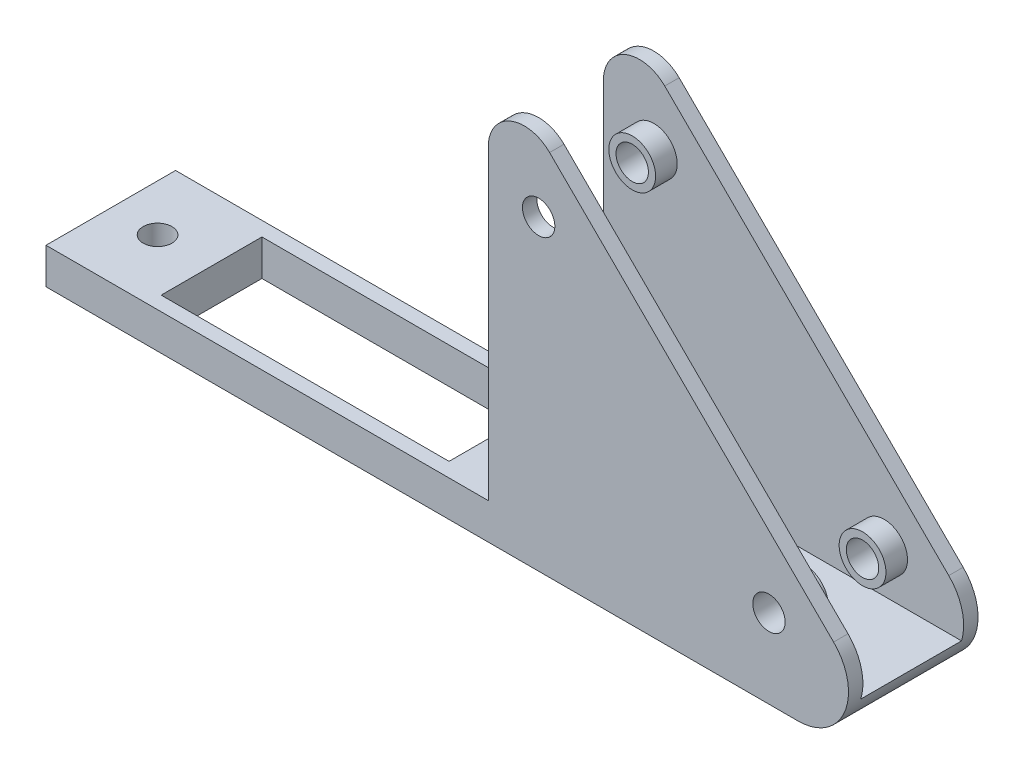
ISO-10303-21;
HEADER;
FILE_DESCRIPTION(('STEP AP214'),'2;1');
FILE_NAME('part.step','',(''),(''),'','','');
FILE_SCHEMA(('AUTOMOTIVE_DESIGN { 1 0 10303 214 1 1 1 1 }'));
ENDSEC;
DATA;
#1=APPLICATION_CONTEXT('core data for automotive mechanical design processes');
#2=APPLICATION_PROTOCOL_DEFINITION('international standard','automotive_design',2000,#1);
#3=PRODUCT_CONTEXT('',#1,'mechanical');
#4=PRODUCT('Part','Part','',(#3));
#5=PRODUCT_RELATED_PRODUCT_CATEGORY('part','',(#4));
#6=PRODUCT_DEFINITION_FORMATION('','',#4);
#7=PRODUCT_DEFINITION_CONTEXT('part definition',#1,'design');
#8=PRODUCT_DEFINITION('design','',#6,#7);
#9=PRODUCT_DEFINITION_SHAPE('','',#8);
#10=(LENGTH_UNIT() NAMED_UNIT(*) SI_UNIT(.MILLI.,.METRE.));
#11=(NAMED_UNIT(*) PLANE_ANGLE_UNIT() SI_UNIT($,.RADIAN.));
#12=(NAMED_UNIT(*) SI_UNIT($,.STERADIAN.) SOLID_ANGLE_UNIT());
#13=UNCERTAINTY_MEASURE_WITH_UNIT(LENGTH_MEASURE(1.E-05),#10,'distance_accuracy_value','');
#14=(GEOMETRIC_REPRESENTATION_CONTEXT(3) GLOBAL_UNCERTAINTY_ASSIGNED_CONTEXT((#13)) GLOBAL_UNIT_ASSIGNED_CONTEXT((#10,
#11,#12)) REPRESENTATION_CONTEXT('',''));
#15=CARTESIAN_POINT('',(0.,0.,0.));
#16=DIRECTION('',(0.,0.,1.));
#17=DIRECTION('',(1.,0.,0.));
#18=AXIS2_PLACEMENT_3D('',#15,#16,#17);
#19=CARTESIAN_POINT('',(0.,0.,-7.));
#20=DIRECTION('',(0.,0.,-1.));
#21=DIRECTION('',(-1.,0.,0.));
#22=AXIS2_PLACEMENT_3D('',#19,#20,#21);
#23=PLANE('',#22);
#24=CARTESIAN_POINT('',(32.447088785675,42.64,-7.));
#25=DIRECTION('',(0.,0.,-1.));
#26=DIRECTION('',(-1.,0.,0.));
#27=AXIS2_PLACEMENT_3D('',#24,#25,#26);
#28=CIRCLE('',#27,3.25);
#29=CARTESIAN_POINT('',(29.197088785675,42.64,-7.));
#30=VERTEX_POINT('',#29);
#31=EDGE_CURVE('E45',#30,#30,#28,.F.);
#32=ORIENTED_EDGE('',*,*,#31,.F.);
#33=EDGE_LOOP('',(#32));
#34=FACE_BOUND('',#33,.T.);
#35=DIRECTION('',(-0.709673079753414,0.704531134779226,0.));
#36=VECTOR('',#35,1.);
#37=CARTESIAN_POINT('',(42.4302873975062,42.7399603023173,-7.));
#38=LINE('',#37,#36);
#39=CARTESIAN_POINT('',(73.4271241007794,11.9677115582739,-7.));
#40=VERTEX_POINT('',#39);
#41=CARTESIAN_POINT('',(33.9683434163894,51.1405931648827,-7.));
#42=VERTEX_POINT('',#41);
#43=EDGE_CURVE('E186',#40,#42,#38,.T.);
#44=ORIENTED_EDGE('',*,*,#43,.T.);
#45=CARTESIAN_POINT('',(30.4456877424932,47.5922277661156,-7.));
#46=DIRECTION('',(0.,0.,-1.));
#47=DIRECTION('',(-1.,0.,0.));
#48=AXIS2_PLACEMENT_3D('',#45,#46,#47);
#49=CIRCLE('',#48,5.);
#50=CARTESIAN_POINT('',(25.4456877424932,47.5922277661156,-7.));
#51=VERTEX_POINT('',#50);
#52=EDGE_CURVE('E288',#42,#51,#49,.F.);
#53=ORIENTED_EDGE('',*,*,#52,.T.);
#54=DIRECTION('',(0.,-1.,0.));
#55=VECTOR('',#54,1.);
#56=CARTESIAN_POINT('',(25.4456877424932,0.,-7.));
#57=LINE('',#56,#55);
#58=CARTESIAN_POINT('',(25.4456877424932,5.,-7.));
#59=VERTEX_POINT('',#58);
#60=EDGE_CURVE('E424',#51,#59,#57,.T.);
#61=ORIENTED_EDGE('',*,*,#60,.T.);
#62=DIRECTION('',(1.,0.,0.));
#63=VECTOR('',#62,1.);
#64=CARTESIAN_POINT('',(0.,5.,-7.));
#65=LINE('',#64,#63);
#66=CARTESIAN_POINT('',(75.2036100898242,5.,-7.));
#67=VERTEX_POINT('',#66);
#68=EDGE_CURVE('E180',#59,#67,#65,.T.);
#69=ORIENTED_EDGE('',*,*,#68,.T.);
#70=CARTESIAN_POINT('',(68.4954061573248,7.,-7.));
#71=DIRECTION('',(0.,0.,-1.));
#72=DIRECTION('',(-1.,0.,0.));
#73=AXIS2_PLACEMENT_3D('',#70,#71,#72);
#74=CIRCLE('',#73,7.);
#75=EDGE_CURVE('E281',#67,#40,#74,.F.);
#76=ORIENTED_EDGE('',*,*,#75,.T.);
#77=EDGE_LOOP('',(#44,#53,#61,#69,#76));
#78=FACE_BOUND('',#77,.T.);
#79=CARTESIAN_POINT('',(64.4456887550486,11.,-7.));
#80=DIRECTION('',(0.,0.,-1.));
#81=DIRECTION('',(-1.,0.,0.));
#82=AXIS2_PLACEMENT_3D('',#79,#80,#81);
#83=CIRCLE('',#82,3.25000000000001);
#84=CARTESIAN_POINT('',(61.1956887550486,11.,-7.));
#85=VERTEX_POINT('',#84);
#86=EDGE_CURVE('E11',#85,#85,#83,.F.);
#87=ORIENTED_EDGE('',*,*,#86,.F.);
#88=EDGE_LOOP('',(#87));
#89=FACE_BOUND('',#88,.T.);
#90=ADVANCED_FACE('F37',(#34,#78,#89),#23,.F.);
#91=CARTESIAN_POINT('',(0.,0.,7.));
#92=DIRECTION('',(0.,0.,1.));
#93=DIRECTION('',(1.,0.,0.));
#94=AXIS2_PLACEMENT_3D('',#91,#92,#93);
#95=PLANE('',#94);
#96=DIRECTION('',(-1.85444623616738E-08,1.,0.));
#97=VECTOR('',#96,1.);
#98=CARTESIAN_POINT('',(25.4456888477709,4.71876619104352E-07,7.));
#99=LINE('',#98,#97);
#100=CARTESIAN_POINT('',(25.4456882487709,5.,7.));
#101=VERTEX_POINT('',#100);
#102=CARTESIAN_POINT('',(25.4456879651987,47.5922274523015,7.));
#103=VERTEX_POINT('',#102);
#104=EDGE_CURVE('E200',#101,#103,#99,.T.);
#105=ORIENTED_EDGE('',*,*,#104,.T.);
#106=CARTESIAN_POINT('',(30.4456879651987,47.5922275450238,7.));
#107=DIRECTION('',(0.,0.,1.));
#108=DIRECTION('',(1.,0.,0.));
#109=AXIS2_PLACEMENT_3D('',#106,#107,#108);
#110=CIRCLE('',#109,5.);
#111=CARTESIAN_POINT('',(33.9683436390948,51.1405929437908,7.));
#112=VERTEX_POINT('',#111);
#113=EDGE_CURVE('E295',#103,#112,#110,.F.);
#114=ORIENTED_EDGE('',*,*,#113,.T.);
#115=DIRECTION('',(0.709673079753414,-0.704531134779226,0.));
#116=VECTOR('',#115,1.);
#117=CARTESIAN_POINT('',(42.4302873975062,42.7399603023173,7.));
#118=LINE('',#117,#116);
#119=CARTESIAN_POINT('',(73.4271241007794,11.9677115582739,7.));
#120=VERTEX_POINT('',#119);
#121=EDGE_CURVE('E201',#112,#120,#118,.T.);
#122=ORIENTED_EDGE('',*,*,#121,.T.);
#123=CARTESIAN_POINT('',(68.4954061573248,7.,7.));
#124=DIRECTION('',(0.,0.,1.));
#125=DIRECTION('',(1.,0.,0.));
#126=AXIS2_PLACEMENT_3D('',#123,#124,#125);
#127=CIRCLE('',#126,7.);
#128=CARTESIAN_POINT('',(75.2036100898242,5.,7.));
#129=VERTEX_POINT('',#128);
#130=EDGE_CURVE('E277',#120,#129,#127,.F.);
#131=ORIENTED_EDGE('',*,*,#130,.T.);
#132=DIRECTION('',(-1.,0.,0.));
#133=VECTOR('',#132,1.);
#134=CARTESIAN_POINT('',(0.,5.,7.));
#135=LINE('',#134,#133);
#136=EDGE_CURVE('E198',#129,#101,#135,.T.);
#137=ORIENTED_EDGE('',*,*,#136,.T.);
#138=EDGE_LOOP('',(#105,#114,#122,#131,#137));
#139=FACE_BOUND('',#138,.T.);
#140=CARTESIAN_POINT('',(32.447088785675,42.64,7.));
#141=DIRECTION('',(0.,0.,1.));
#142=DIRECTION('',(1.,0.,0.));
#143=AXIS2_PLACEMENT_3D('',#140,#141,#142);
#144=CIRCLE('',#143,2.25);
#145=CARTESIAN_POINT('',(34.697088785675,42.64,7.));
#146=VERTEX_POINT('',#145);
#147=EDGE_CURVE('E193',#146,#146,#144,.T.);
#148=ORIENTED_EDGE('',*,*,#147,.T.);
#149=EDGE_LOOP('',(#148));
#150=FACE_BOUND('',#149,.T.);
#151=CARTESIAN_POINT('',(64.4456887550486,11.,7.));
#152=DIRECTION('',(0.,0.,1.));
#153=DIRECTION('',(1.,0.,0.));
#154=AXIS2_PLACEMENT_3D('',#151,#152,#153);
#155=CIRCLE('',#154,3.25);
#156=CARTESIAN_POINT('',(67.6956887550486,11.,7.));
#157=VERTEX_POINT('',#156);
#158=EDGE_CURVE('E297',#157,#157,#155,.F.);
#159=ORIENTED_EDGE('',*,*,#158,.F.);
#160=EDGE_LOOP('',(#159));
#161=FACE_BOUND('',#160,.T.);
#162=ADVANCED_FACE('F306',(#139,#150,#161),#95,.F.);
#163=CARTESIAN_POINT('',(0.,5.,0.));
#164=DIRECTION('',(0.,-1.,0.));
#165=DIRECTION('',(0.,0.,-1.));
#166=AXIS2_PLACEMENT_3D('',#163,#164,#165);
#167=PLANE('',#166);
#168=DIRECTION('',(0.,0.,1.));
#169=VECTOR('',#168,1.);
#170=CARTESIAN_POINT('',(-22.,5.,-7.));
#171=LINE('',#170,#169);
#172=CARTESIAN_POINT('',(-22.,5.,-7.));
#173=VERTEX_POINT('',#172);
#174=CARTESIAN_POINT('',(-22.,5.,7.));
#175=VERTEX_POINT('',#174);
#176=EDGE_CURVE('E221',#173,#175,#171,.T.);
#177=ORIENTED_EDGE('',*,*,#176,.F.);
#178=DIRECTION('',(-1.,0.,0.));
#179=VECTOR('',#178,1.);
#180=CARTESIAN_POINT('',(-22.,5.,-7.));
#181=LINE('',#180,#179);
#182=CARTESIAN_POINT('',(18.,5.,-7.));
#183=VERTEX_POINT('',#182);
#184=EDGE_CURVE('E229',#183,#173,#181,.T.);
#185=ORIENTED_EDGE('',*,*,#184,.F.);
#186=DIRECTION('',(0.,0.,-1.));
#187=VECTOR('',#186,1.);
#188=CARTESIAN_POINT('',(18.,5.,-7.));
#189=LINE('',#188,#187);
#190=CARTESIAN_POINT('',(18.,5.,7.));
#191=VERTEX_POINT('',#190);
#192=EDGE_CURVE('E226',#191,#183,#189,.T.);
#193=ORIENTED_EDGE('',*,*,#192,.F.);
#194=DIRECTION('',(1.,0.,0.));
#195=VECTOR('',#194,1.);
#196=CARTESIAN_POINT('',(-22.,5.,7.));
#197=LINE('',#196,#195);
#198=EDGE_CURVE('E223',#175,#191,#197,.T.);
#199=ORIENTED_EDGE('',*,*,#198,.F.);
#200=EDGE_LOOP('',(#177,#185,#193,#199));
#201=FACE_BOUND('',#200,.T.);
#202=CARTESIAN_POINT('',(25.5,5.,0.));
#203=DIRECTION('',(0.,1.,0.));
#204=DIRECTION('',(0.,0.,1.));
#205=AXIS2_PLACEMENT_3D('',#202,#203,#204);
#206=CIRCLE('',#205,2.);
#207=CARTESIAN_POINT('',(25.5,5.,2.));
#208=VERTEX_POINT('',#207);
#209=EDGE_CURVE('E215',#208,#208,#206,.T.);
#210=ORIENTED_EDGE('',*,*,#209,.F.);
#211=EDGE_LOOP('',(#210));
#212=FACE_BOUND('',#211,.T.);
#213=CARTESIAN_POINT('',(-29.5,5.,0.));
#214=DIRECTION('',(0.,1.,0.));
#215=DIRECTION('',(0.,0.,1.));
#216=AXIS2_PLACEMENT_3D('',#213,#214,#215);
#217=CIRCLE('',#216,2.);
#218=CARTESIAN_POINT('',(-29.5,5.,2.));
#219=VERTEX_POINT('',#218);
#220=EDGE_CURVE('E209',#219,#219,#217,.T.);
#221=ORIENTED_EDGE('',*,*,#220,.F.);
#222=EDGE_LOOP('',(#221));
#223=FACE_BOUND('',#222,.T.);
#224=ORIENTED_EDGE('',*,*,#136,.F.);
#225=DIRECTION('',(0.,0.,1.));
#226=VECTOR('',#225,1.);
#227=CARTESIAN_POINT('',(75.2036100898242,5.,7.));
#228=LINE('',#227,#226);
#229=EDGE_CURVE('E279',#129,#67,#228,.F.);
#230=ORIENTED_EDGE('',*,*,#229,.T.);
#231=ORIENTED_EDGE('',*,*,#68,.F.);
#232=DIRECTION('',(0.,0.,-1.));
#233=VECTOR('',#232,1.);
#234=CARTESIAN_POINT('',(25.4456877424932,5.,-7.));
#235=LINE('',#234,#233);
#236=CARTESIAN_POINT('',(25.4456877424932,5.,-9.));
#237=VERTEX_POINT('',#236);
#238=EDGE_CURVE('E158',#59,#237,#235,.T.);
#239=ORIENTED_EDGE('',*,*,#238,.T.);
#240=DIRECTION('',(-1.,0.,0.));
#241=VECTOR('',#240,1.);
#242=CARTESIAN_POINT('',(-36.,5.,-9.));
#243=LINE('',#242,#241);
#244=CARTESIAN_POINT('',(-36.,5.,-9.));
#245=VERTEX_POINT('',#244);
#246=EDGE_CURVE('E166',#237,#245,#243,.T.);
#247=ORIENTED_EDGE('',*,*,#246,.T.);
#248=DIRECTION('',(0.,0.,1.));
#249=VECTOR('',#248,1.);
#250=CARTESIAN_POINT('',(-36.,5.,9.));
#251=LINE('',#250,#249);
#252=CARTESIAN_POINT('',(-36.,5.,9.));
#253=VERTEX_POINT('',#252);
#254=EDGE_CURVE('E173',#245,#253,#251,.T.);
#255=ORIENTED_EDGE('',*,*,#254,.T.);
#256=DIRECTION('',(1.,0.,0.));
#257=VECTOR('',#256,1.);
#258=CARTESIAN_POINT('',(-36.,5.,9.));
#259=LINE('',#258,#257);
#260=CARTESIAN_POINT('',(25.4456882487709,5.,9.));
#261=VERTEX_POINT('',#260);
#262=EDGE_CURVE('E253',#253,#261,#259,.T.);
#263=ORIENTED_EDGE('',*,*,#262,.T.);
#264=DIRECTION('',(0.,0.,1.));
#265=VECTOR('',#264,1.);
#266=CARTESIAN_POINT('',(25.4456882487709,5.,7.));
#267=LINE('',#266,#265);
#268=EDGE_CURVE('E190',#101,#261,#267,.T.);
#269=ORIENTED_EDGE('',*,*,#268,.F.);
#270=EDGE_LOOP('',(#224,#230,#231,#239,#247,#255,#263,#269));
#271=FACE_BOUND('',#270,.T.);
#272=ADVANCED_FACE('F178',(#201,#212,#223,#271),#167,.F.);
#273=CARTESIAN_POINT('',(0.,0.,0.));
#274=DIRECTION('',(0.,-1.,0.));
#275=DIRECTION('',(0.,0.,-1.));
#276=AXIS2_PLACEMENT_3D('',#273,#274,#275);
#277=PLANE('',#276);
#278=CARTESIAN_POINT('',(25.5,0.,0.));
#279=DIRECTION('',(0.,1.,0.));
#280=DIRECTION('',(0.,0.,1.));
#281=AXIS2_PLACEMENT_3D('',#278,#279,#280);
#282=CIRCLE('',#281,2.);
#283=CARTESIAN_POINT('',(25.5,0.,2.));
#284=VERTEX_POINT('',#283);
#285=EDGE_CURVE('E212',#284,#284,#282,.T.);
#286=ORIENTED_EDGE('',*,*,#285,.T.);
#287=EDGE_LOOP('',(#286));
#288=FACE_BOUND('',#287,.T.);
#289=DIRECTION('',(-1.,0.,0.));
#290=VECTOR('',#289,1.);
#291=CARTESIAN_POINT('',(-36.,0.,-9.));
#292=LINE('',#291,#290);
#293=CARTESIAN_POINT('',(68.4954061573248,0.,-9.));
#294=VERTEX_POINT('',#293);
#295=CARTESIAN_POINT('',(-36.,0.,-9.));
#296=VERTEX_POINT('',#295);
#297=EDGE_CURVE('E250',#294,#296,#292,.T.);
#298=ORIENTED_EDGE('',*,*,#297,.F.);
#299=DIRECTION('',(0.,0.,-1.));
#300=VECTOR('',#299,1.);
#301=CARTESIAN_POINT('',(68.4954061573248,0.,-7.));
#302=LINE('',#301,#300);
#303=CARTESIAN_POINT('',(68.4954061573248,0.,9.));
#304=VERTEX_POINT('',#303);
#305=EDGE_CURVE('E269',#294,#304,#302,.F.);
#306=ORIENTED_EDGE('',*,*,#305,.T.);
#307=DIRECTION('',(1.,0.,0.));
#308=VECTOR('',#307,1.);
#309=CARTESIAN_POINT('',(-36.,0.,9.));
#310=LINE('',#309,#308);
#311=CARTESIAN_POINT('',(-36.,0.,9.));
#312=VERTEX_POINT('',#311);
#313=EDGE_CURVE('E174',#312,#304,#310,.T.);
#314=ORIENTED_EDGE('',*,*,#313,.F.);
#315=DIRECTION('',(0.,0.,1.));
#316=VECTOR('',#315,1.);
#317=CARTESIAN_POINT('',(-36.,0.,9.));
#318=LINE('',#317,#316);
#319=EDGE_CURVE('E257',#296,#312,#318,.T.);
#320=ORIENTED_EDGE('',*,*,#319,.F.);
#321=EDGE_LOOP('',(#298,#306,#314,#320));
#322=FACE_BOUND('',#321,.T.);
#323=DIRECTION('',(-1.,0.,0.));
#324=VECTOR('',#323,1.);
#325=CARTESIAN_POINT('',(-22.,0.,-7.));
#326=LINE('',#325,#324);
#327=CARTESIAN_POINT('',(18.,0.,-7.));
#328=VERTEX_POINT('',#327);
#329=CARTESIAN_POINT('',(-22.,0.,-7.));
#330=VERTEX_POINT('',#329);
#331=EDGE_CURVE('E224',#328,#330,#326,.T.);
#332=ORIENTED_EDGE('',*,*,#331,.T.);
#333=DIRECTION('',(0.,0.,1.));
#334=VECTOR('',#333,1.);
#335=CARTESIAN_POINT('',(-22.,0.,-7.));
#336=LINE('',#335,#334);
#337=CARTESIAN_POINT('',(-22.,0.,7.));
#338=VERTEX_POINT('',#337);
#339=EDGE_CURVE('E218',#330,#338,#336,.T.);
#340=ORIENTED_EDGE('',*,*,#339,.T.);
#341=DIRECTION('',(1.,0.,0.));
#342=VECTOR('',#341,1.);
#343=CARTESIAN_POINT('',(-22.,0.,7.));
#344=LINE('',#343,#342);
#345=CARTESIAN_POINT('',(18.,0.,7.));
#346=VERTEX_POINT('',#345);
#347=EDGE_CURVE('E234',#338,#346,#344,.T.);
#348=ORIENTED_EDGE('',*,*,#347,.T.);
#349=DIRECTION('',(0.,0.,-1.));
#350=VECTOR('',#349,1.);
#351=CARTESIAN_POINT('',(18.,0.,-7.));
#352=LINE('',#351,#350);
#353=EDGE_CURVE('E237',#346,#328,#352,.T.);
#354=ORIENTED_EDGE('',*,*,#353,.T.);
#355=EDGE_LOOP('',(#332,#340,#348,#354));
#356=FACE_BOUND('',#355,.T.);
#357=CARTESIAN_POINT('',(-29.5,0.,0.));
#358=DIRECTION('',(0.,1.,0.));
#359=DIRECTION('',(0.,0.,1.));
#360=AXIS2_PLACEMENT_3D('',#357,#358,#359);
#361=CIRCLE('',#360,2.);
#362=CARTESIAN_POINT('',(-29.5,0.,2.));
#363=VERTEX_POINT('',#362);
#364=EDGE_CURVE('E208',#363,#363,#361,.T.);
#365=ORIENTED_EDGE('',*,*,#364,.T.);
#366=EDGE_LOOP('',(#365));
#367=FACE_BOUND('',#366,.T.);
#368=ADVANCED_FACE('F401',(#288,#322,#356,#367),#277,.T.);
#369=CARTESIAN_POINT('',(-36.,5.,-9.));
#370=DIRECTION('',(0.,0.,1.));
#371=DIRECTION('',(1.,0.,0.));
#372=AXIS2_PLACEMENT_3D('',#369,#370,#371);
#373=PLANE('',#372);
#374=DIRECTION('',(0.,-1.,0.));
#375=VECTOR('',#374,1.);
#376=CARTESIAN_POINT('',(25.4456877424932,0.,-9.));
#377=LINE('',#376,#375);
#378=CARTESIAN_POINT('',(25.4456877424932,47.5922277661156,-9.));
#379=VERTEX_POINT('',#378);
#380=EDGE_CURVE('E153',#379,#237,#377,.T.);
#381=ORIENTED_EDGE('',*,*,#380,.F.);
#382=CARTESIAN_POINT('',(30.4456877424932,47.5922277661156,-9.));
#383=DIRECTION('',(0.,0.,1.));
#384=DIRECTION('',(1.,0.,0.));
#385=AXIS2_PLACEMENT_3D('',#382,#383,#384);
#386=CIRCLE('',#385,5.);
#387=CARTESIAN_POINT('',(33.9683434163894,51.1405931648827,-9.));
#388=VERTEX_POINT('',#387);
#389=EDGE_CURVE('E284',#379,#388,#386,.F.);
#390=ORIENTED_EDGE('',*,*,#389,.T.);
#391=DIRECTION('',(-0.709673079753414,0.704531134779226,0.));
#392=VECTOR('',#391,1.);
#393=CARTESIAN_POINT('',(42.4302873975062,42.7399603023173,-9.));
#394=LINE('',#393,#392);
#395=CARTESIAN_POINT('',(73.4271241007794,11.9677115582739,-9.));
#396=VERTEX_POINT('',#395);
#397=EDGE_CURVE('E162',#396,#388,#394,.T.);
#398=ORIENTED_EDGE('',*,*,#397,.F.);
#399=CARTESIAN_POINT('',(68.4954061573248,7.,-9.));
#400=DIRECTION('',(0.,0.,1.));
#401=DIRECTION('',(1.,0.,0.));
#402=AXIS2_PLACEMENT_3D('',#399,#400,#401);
#403=CIRCLE('',#402,7.);
#404=EDGE_CURVE('E267',#396,#294,#403,.F.);
#405=ORIENTED_EDGE('',*,*,#404,.T.);
#406=ORIENTED_EDGE('',*,*,#297,.T.);
#407=DIRECTION('',(0.,-1.,0.));
#408=VECTOR('',#407,1.);
#409=CARTESIAN_POINT('',(-36.,5.,-9.));
#410=LINE('',#409,#408);
#411=EDGE_CURVE('E170',#245,#296,#410,.T.);
#412=ORIENTED_EDGE('',*,*,#411,.F.);
#413=ORIENTED_EDGE('',*,*,#246,.F.);
#414=EDGE_LOOP('',(#381,#390,#398,#405,#406,#412,#413));
#415=FACE_BOUND('',#414,.T.);
#416=CARTESIAN_POINT('',(64.4456887550486,11.,-9.));
#417=DIRECTION('',(0.,0.,-1.));
#418=DIRECTION('',(-1.,0.,0.));
#419=AXIS2_PLACEMENT_3D('',#416,#417,#418);
#420=CIRCLE('',#419,2.25);
#421=CARTESIAN_POINT('',(62.1956887550486,11.,-9.));
#422=VERTEX_POINT('',#421);
#423=EDGE_CURVE('E432',#422,#422,#420,.T.);
#424=ORIENTED_EDGE('',*,*,#423,.F.);
#425=EDGE_LOOP('',(#424));
#426=FACE_BOUND('',#425,.T.);
#427=CARTESIAN_POINT('',(32.447088785675,42.64,-9.));
#428=DIRECTION('',(0.,0.,-1.));
#429=DIRECTION('',(-1.,0.,0.));
#430=AXIS2_PLACEMENT_3D('',#427,#428,#429);
#431=CIRCLE('',#430,2.25);
#432=CARTESIAN_POINT('',(30.197088785675,42.64,-9.));
#433=VERTEX_POINT('',#432);
#434=EDGE_CURVE('E163',#433,#433,#431,.T.);
#435=ORIENTED_EDGE('',*,*,#434,.F.);
#436=EDGE_LOOP('',(#435));
#437=FACE_BOUND('',#436,.T.);
#438=ADVANCED_FACE('F167',(#415,#426,#437),#373,.F.);
#439=CARTESIAN_POINT('',(-36.,5.,9.));
#440=DIRECTION('',(1.,0.,0.));
#441=DIRECTION('',(0.,0.,-1.));
#442=AXIS2_PLACEMENT_3D('',#439,#440,#441);
#443=PLANE('',#442);
#444=ORIENTED_EDGE('',*,*,#319,.T.);
#445=DIRECTION('',(0.,-1.,0.));
#446=VECTOR('',#445,1.);
#447=CARTESIAN_POINT('',(-36.,5.,9.));
#448=LINE('',#447,#446);
#449=EDGE_CURVE('E255',#253,#312,#448,.T.);
#450=ORIENTED_EDGE('',*,*,#449,.F.);
#451=ORIENTED_EDGE('',*,*,#254,.F.);
#452=ORIENTED_EDGE('',*,*,#411,.T.);
#453=EDGE_LOOP('',(#444,#450,#451,#452));
#454=FACE_BOUND('',#453,.T.);
#455=ADVANCED_FACE('F408',(#454),#443,.F.);
#456=CARTESIAN_POINT('',(-36.,5.,9.));
#457=DIRECTION('',(0.,0.,-1.));
#458=DIRECTION('',(-1.,0.,0.));
#459=AXIS2_PLACEMENT_3D('',#456,#457,#458);
#460=PLANE('',#459);
#461=DIRECTION('',(0.709673079753414,-0.704531134779226,0.));
#462=VECTOR('',#461,1.);
#463=CARTESIAN_POINT('',(42.4302873975062,42.7399603023173,9.));
#464=LINE('',#463,#462);
#465=CARTESIAN_POINT('',(33.9683436390948,51.1405929437908,9.));
#466=VERTEX_POINT('',#465);
#467=CARTESIAN_POINT('',(73.4271241007794,11.9677115582739,9.));
#468=VERTEX_POINT('',#467);
#469=EDGE_CURVE('E203',#466,#468,#464,.T.);
#470=ORIENTED_EDGE('',*,*,#469,.F.);
#471=CARTESIAN_POINT('',(30.4456879651987,47.5922275450238,9.));
#472=DIRECTION('',(0.,0.,-1.));
#473=DIRECTION('',(-1.,0.,0.));
#474=AXIS2_PLACEMENT_3D('',#471,#472,#473);
#475=CIRCLE('',#474,5.);
#476=CARTESIAN_POINT('',(25.4456879651987,47.5922274523015,9.));
#477=VERTEX_POINT('',#476);
#478=EDGE_CURVE('E60',#466,#477,#475,.F.);
#479=ORIENTED_EDGE('',*,*,#478,.T.);
#480=DIRECTION('',(-1.85444623616738E-08,1.,0.));
#481=VECTOR('',#480,1.);
#482=CARTESIAN_POINT('',(25.4456888477709,4.71876619104352E-07,9.));
#483=LINE('',#482,#481);
#484=EDGE_CURVE('E194',#261,#477,#483,.T.);
#485=ORIENTED_EDGE('',*,*,#484,.F.);
#486=ORIENTED_EDGE('',*,*,#262,.F.);
#487=ORIENTED_EDGE('',*,*,#449,.T.);
#488=ORIENTED_EDGE('',*,*,#313,.T.);
#489=CARTESIAN_POINT('',(68.4954061573248,7.,9.));
#490=DIRECTION('',(0.,0.,-1.));
#491=DIRECTION('',(-1.,0.,0.));
#492=AXIS2_PLACEMENT_3D('',#489,#490,#491);
#493=CIRCLE('',#492,7.);
#494=EDGE_CURVE('E271',#304,#468,#493,.F.);
#495=ORIENTED_EDGE('',*,*,#494,.T.);
#496=EDGE_LOOP('',(#470,#479,#485,#486,#487,#488,#495));
#497=FACE_BOUND('',#496,.T.);
#498=CARTESIAN_POINT('',(64.4456887550486,11.,9.));
#499=DIRECTION('',(0.,0.,1.));
#500=DIRECTION('',(1.,0.,0.));
#501=AXIS2_PLACEMENT_3D('',#498,#499,#500);
#502=CIRCLE('',#501,2.25);
#503=CARTESIAN_POINT('',(66.6956887550486,11.,9.));
#504=VERTEX_POINT('',#503);
#505=EDGE_CURVE('E184',#504,#504,#502,.T.);
#506=ORIENTED_EDGE('',*,*,#505,.F.);
#507=EDGE_LOOP('',(#506));
#508=FACE_BOUND('',#507,.T.);
#509=CARTESIAN_POINT('',(32.447088785675,42.64,9.));
#510=DIRECTION('',(0.,0.,1.));
#511=DIRECTION('',(1.,0.,0.));
#512=AXIS2_PLACEMENT_3D('',#509,#510,#511);
#513=CIRCLE('',#512,2.25);
#514=CARTESIAN_POINT('',(34.697088785675,42.64,9.));
#515=VERTEX_POINT('',#514);
#516=EDGE_CURVE('E181',#515,#515,#513,.T.);
#517=ORIENTED_EDGE('',*,*,#516,.F.);
#518=EDGE_LOOP('',(#517));
#519=FACE_BOUND('',#518,.T.);
#520=ADVANCED_FACE('F397',(#497,#508,#519),#460,.F.);
#521=CARTESIAN_POINT('',(-22.,5.,-7.));
#522=DIRECTION('',(1.,0.,0.));
#523=DIRECTION('',(0.,0.,-1.));
#524=AXIS2_PLACEMENT_3D('',#521,#522,#523);
#525=PLANE('',#524);
#526=ORIENTED_EDGE('',*,*,#339,.F.);
#527=DIRECTION('',(0.,-1.,0.));
#528=VECTOR('',#527,1.);
#529=CARTESIAN_POINT('',(-22.,5.,-7.));
#530=LINE('',#529,#528);
#531=EDGE_CURVE('E231',#173,#330,#530,.T.);
#532=ORIENTED_EDGE('',*,*,#531,.F.);
#533=ORIENTED_EDGE('',*,*,#176,.T.);
#534=DIRECTION('',(0.,-1.,0.));
#535=VECTOR('',#534,1.);
#536=CARTESIAN_POINT('',(-22.,5.,7.));
#537=LINE('',#536,#535);
#538=EDGE_CURVE('E248',#175,#338,#537,.T.);
#539=ORIENTED_EDGE('',*,*,#538,.T.);
#540=EDGE_LOOP('',(#526,#532,#533,#539));
#541=FACE_BOUND('',#540,.T.);
#542=ADVANCED_FACE('F393',(#541),#525,.T.);
#543=CARTESIAN_POINT('',(-22.,5.,7.));
#544=DIRECTION('',(0.,0.,-1.));
#545=DIRECTION('',(-1.,0.,0.));
#546=AXIS2_PLACEMENT_3D('',#543,#544,#545);
#547=PLANE('',#546);
#548=ORIENTED_EDGE('',*,*,#347,.F.);
#549=ORIENTED_EDGE('',*,*,#538,.F.);
#550=ORIENTED_EDGE('',*,*,#198,.T.);
#551=DIRECTION('',(0.,-1.,0.));
#552=VECTOR('',#551,1.);
#553=CARTESIAN_POINT('',(18.,5.,7.));
#554=LINE('',#553,#552);
#555=EDGE_CURVE('E246',#191,#346,#554,.T.);
#556=ORIENTED_EDGE('',*,*,#555,.T.);
#557=EDGE_LOOP('',(#548,#549,#550,#556));
#558=FACE_BOUND('',#557,.T.);
#559=ADVANCED_FACE('F389',(#558),#547,.T.);
#560=CARTESIAN_POINT('',(18.,5.,-7.));
#561=DIRECTION('',(-1.,0.,0.));
#562=DIRECTION('',(0.,0.,1.));
#563=AXIS2_PLACEMENT_3D('',#560,#561,#562);
#564=PLANE('',#563);
#565=ORIENTED_EDGE('',*,*,#353,.F.);
#566=ORIENTED_EDGE('',*,*,#555,.F.);
#567=ORIENTED_EDGE('',*,*,#192,.T.);
#568=DIRECTION('',(0.,-1.,0.));
#569=VECTOR('',#568,1.);
#570=CARTESIAN_POINT('',(18.,5.,-7.));
#571=LINE('',#570,#569);
#572=EDGE_CURVE('E244',#183,#328,#571,.T.);
#573=ORIENTED_EDGE('',*,*,#572,.T.);
#574=EDGE_LOOP('',(#565,#566,#567,#573));
#575=FACE_BOUND('',#574,.T.);
#576=ADVANCED_FACE('F385',(#575),#564,.T.);
#577=CARTESIAN_POINT('',(-22.,5.,-7.));
#578=DIRECTION('',(0.,0.,1.));
#579=DIRECTION('',(1.,0.,0.));
#580=AXIS2_PLACEMENT_3D('',#577,#578,#579);
#581=PLANE('',#580);
#582=ORIENTED_EDGE('',*,*,#331,.F.);
#583=ORIENTED_EDGE('',*,*,#572,.F.);
#584=ORIENTED_EDGE('',*,*,#184,.T.);
#585=ORIENTED_EDGE('',*,*,#531,.T.);
#586=EDGE_LOOP('',(#582,#583,#584,#585));
#587=FACE_BOUND('',#586,.T.);
#588=ADVANCED_FACE('F381',(#587),#581,.T.);
#589=CARTESIAN_POINT('',(25.5,5.,0.));
#590=DIRECTION('',(0.,-1.,0.));
#591=DIRECTION('',(0.,0.,-1.));
#592=AXIS2_PLACEMENT_3D('',#589,#590,#591);
#593=CYLINDRICAL_SURFACE('',#592,2.);
#594=ORIENTED_EDGE('',*,*,#209,.T.);
#595=EDGE_LOOP('',(#594));
#596=FACE_BOUND('',#595,.T.);
#597=ORIENTED_EDGE('',*,*,#285,.F.);
#598=EDGE_LOOP('',(#597));
#599=FACE_BOUND('',#598,.T.);
#600=ADVANCED_FACE('F377',(#596,#599),#593,.F.);
#601=CARTESIAN_POINT('',(-29.5,5.,0.));
#602=DIRECTION('',(0.,-1.,0.));
#603=DIRECTION('',(0.,0.,-1.));
#604=AXIS2_PLACEMENT_3D('',#601,#602,#603);
#605=CYLINDRICAL_SURFACE('',#604,2.);
#606=ORIENTED_EDGE('',*,*,#220,.T.);
#607=EDGE_LOOP('',(#606));
#608=FACE_BOUND('',#607,.T.);
#609=ORIENTED_EDGE('',*,*,#364,.F.);
#610=EDGE_LOOP('',(#609));
#611=FACE_BOUND('',#610,.T.);
#612=ADVANCED_FACE('F373',(#608,#611),#605,.F.);
#613=CARTESIAN_POINT('',(42.4302873975062,42.7399603023173,7.));
#614=DIRECTION('',(-0.704531134779226,-0.709673079753414,0.));
#615=DIRECTION('',(0.709673079753414,-0.704531134779226,0.));
#616=AXIS2_PLACEMENT_3D('',#613,#614,#615);
#617=PLANE('',#616);
#618=ORIENTED_EDGE('',*,*,#121,.F.);
#619=DIRECTION('',(0.,0.,1.));
#620=VECTOR('',#619,1.);
#621=CARTESIAN_POINT('',(33.9683436390948,51.1405929437908,7.));
#622=LINE('',#621,#620);
#623=EDGE_CURVE('E290',#112,#466,#622,.T.);
#624=ORIENTED_EDGE('',*,*,#623,.T.);
#625=ORIENTED_EDGE('',*,*,#469,.T.);
#626=DIRECTION('',(0.,0.,1.));
#627=VECTOR('',#626,1.);
#628=CARTESIAN_POINT('',(73.4271241007794,11.9677115582739,8.));
#629=LINE('',#628,#627);
#630=EDGE_CURVE('E274',#468,#120,#629,.F.);
#631=ORIENTED_EDGE('',*,*,#630,.T.);
#632=EDGE_LOOP('',(#618,#624,#625,#631));
#633=FACE_BOUND('',#632,.T.);
#634=ADVANCED_FACE('F364',(#633),#617,.F.);
#635=CARTESIAN_POINT('',(32.447088785675,42.64,7.));
#636=DIRECTION('',(0.,0.,1.));
#637=DIRECTION('',(1.,0.,0.));
#638=AXIS2_PLACEMENT_3D('',#635,#636,#637);
#639=CYLINDRICAL_SURFACE('',#638,2.25);
#640=ORIENTED_EDGE('',*,*,#147,.F.);
#641=EDGE_LOOP('',(#640));
#642=FACE_BOUND('',#641,.T.);
#643=ORIENTED_EDGE('',*,*,#516,.T.);
#644=EDGE_LOOP('',(#643));
#645=FACE_BOUND('',#644,.T.);
#646=ADVANCED_FACE('F360',(#642,#645),#639,.F.);
#647=CARTESIAN_POINT('',(64.4456887550486,11.,7.));
#648=DIRECTION('',(0.,0.,1.));
#649=DIRECTION('',(1.,0.,0.));
#650=AXIS2_PLACEMENT_3D('',#647,#648,#649);
#651=CYLINDRICAL_SURFACE('',#650,2.25);
#652=ORIENTED_EDGE('',*,*,#505,.T.);
#653=EDGE_LOOP('',(#652));
#654=FACE_BOUND('',#653,.T.);
#655=CARTESIAN_POINT('',(64.4456887550486,11.,4.));
#656=DIRECTION('',(0.,0.,-1.));
#657=DIRECTION('',(-1.,0.,0.));
#658=AXIS2_PLACEMENT_3D('',#655,#656,#657);
#659=CIRCLE('',#658,2.25);
#660=CARTESIAN_POINT('',(62.1956887550486,11.,4.));
#661=VERTEX_POINT('',#660);
#662=EDGE_CURVE('E447',#661,#661,#659,.T.);
#663=ORIENTED_EDGE('',*,*,#662,.T.);
#664=EDGE_LOOP('',(#663));
#665=FACE_BOUND('',#664,.T.);
#666=ADVANCED_FACE('F357',(#654,#665),#651,.F.);
#667=CARTESIAN_POINT('',(25.4456888477709,4.71876619104352E-07,7.));
#668=DIRECTION('',(1.,1.85444623616738E-08,0.));
#669=DIRECTION('',(-1.85444623616738E-08,1.,0.));
#670=AXIS2_PLACEMENT_3D('',#667,#668,#669);
#671=PLANE('',#670);
#672=ORIENTED_EDGE('',*,*,#484,.T.);
#673=DIRECTION('',(0.,0.,1.));
#674=VECTOR('',#673,1.);
#675=CARTESIAN_POINT('',(25.4456879651987,47.5922274523014,7.));
#676=LINE('',#675,#674);
#677=EDGE_CURVE('E52',#477,#103,#676,.F.);
#678=ORIENTED_EDGE('',*,*,#677,.T.);
#679=ORIENTED_EDGE('',*,*,#104,.F.);
#680=ORIENTED_EDGE('',*,*,#268,.T.);
#681=EDGE_LOOP('',(#672,#678,#679,#680));
#682=FACE_BOUND('',#681,.T.);
#683=ADVANCED_FACE('F350',(#682),#671,.F.);
#684=CARTESIAN_POINT('',(25.4456877424932,0.,-7.));
#685=DIRECTION('',(1.,0.,0.));
#686=DIRECTION('',(0.,1.,0.));
#687=AXIS2_PLACEMENT_3D('',#684,#685,#686);
#688=PLANE('',#687);
#689=ORIENTED_EDGE('',*,*,#60,.F.);
#690=DIRECTION('',(0.,0.,-1.));
#691=VECTOR('',#690,1.);
#692=CARTESIAN_POINT('',(25.4456877424932,47.5922277661156,-7.));
#693=LINE('',#692,#691);
#694=EDGE_CURVE('E160',#51,#379,#693,.T.);
#695=ORIENTED_EDGE('',*,*,#694,.T.);
#696=ORIENTED_EDGE('',*,*,#380,.T.);
#697=ORIENTED_EDGE('',*,*,#238,.F.);
#698=EDGE_LOOP('',(#689,#695,#696,#697));
#699=FACE_BOUND('',#698,.T.);
#700=ADVANCED_FACE('F156',(#699),#688,.F.);
#701=CARTESIAN_POINT('',(32.447088785675,42.64,-7.));
#702=DIRECTION('',(0.,0.,-1.));
#703=DIRECTION('',(-1.,0.,0.));
#704=AXIS2_PLACEMENT_3D('',#701,#702,#703);
#705=CYLINDRICAL_SURFACE('',#704,2.25);
#706=ORIENTED_EDGE('',*,*,#434,.T.);
#707=EDGE_LOOP('',(#706));
#708=FACE_BOUND('',#707,.T.);
#709=CARTESIAN_POINT('',(32.447088785675,42.64,-4.));
#710=DIRECTION('',(0.,0.,1.));
#711=DIRECTION('',(1.,0.,0.));
#712=AXIS2_PLACEMENT_3D('',#709,#710,#711);
#713=CIRCLE('',#712,2.25);
#714=CARTESIAN_POINT('',(34.697088785675,42.64,-4.));
#715=VERTEX_POINT('',#714);
#716=EDGE_CURVE('E441',#715,#715,#713,.T.);
#717=ORIENTED_EDGE('',*,*,#716,.T.);
#718=EDGE_LOOP('',(#717));
#719=FACE_BOUND('',#718,.T.);
#720=ADVANCED_FACE('F349',(#708,#719),#705,.F.);
#721=CARTESIAN_POINT('',(64.4456887550486,11.,-7.));
#722=DIRECTION('',(0.,0.,-1.));
#723=DIRECTION('',(-1.,0.,0.));
#724=AXIS2_PLACEMENT_3D('',#721,#722,#723);
#725=CYLINDRICAL_SURFACE('',#724,2.25);
#726=ORIENTED_EDGE('',*,*,#423,.T.);
#727=EDGE_LOOP('',(#726));
#728=FACE_BOUND('',#727,.T.);
#729=CARTESIAN_POINT('',(64.4456887550486,11.,-4.));
#730=DIRECTION('',(0.,0.,1.));
#731=DIRECTION('',(1.,0.,0.));
#732=AXIS2_PLACEMENT_3D('',#729,#730,#731);
#733=CIRCLE('',#732,2.25);
#734=CARTESIAN_POINT('',(66.6956887550486,11.,-4.));
#735=VERTEX_POINT('',#734);
#736=EDGE_CURVE('E450',#735,#735,#733,.T.);
#737=ORIENTED_EDGE('',*,*,#736,.T.);
#738=EDGE_LOOP('',(#737));
#739=FACE_BOUND('',#738,.T.);
#740=ADVANCED_FACE('F345',(#728,#739),#725,.F.);
#741=CARTESIAN_POINT('',(42.4302873975062,42.7399603023173,-7.));
#742=DIRECTION('',(-0.704531134779226,-0.709673079753414,0.));
#743=DIRECTION('',(0.709673079753414,-0.704531134779226,0.));
#744=AXIS2_PLACEMENT_3D('',#741,#742,#743);
#745=PLANE('',#744);
#746=ORIENTED_EDGE('',*,*,#397,.T.);
#747=DIRECTION('',(0.,0.,-1.));
#748=VECTOR('',#747,1.);
#749=CARTESIAN_POINT('',(33.9683434163894,51.1405931648827,-7.));
#750=LINE('',#749,#748);
#751=EDGE_CURVE('E286',#388,#42,#750,.F.);
#752=ORIENTED_EDGE('',*,*,#751,.T.);
#753=ORIENTED_EDGE('',*,*,#43,.F.);
#754=DIRECTION('',(0.,0.,-1.));
#755=VECTOR('',#754,1.);
#756=CARTESIAN_POINT('',(73.4271241007794,11.9677115582739,-9.));
#757=LINE('',#756,#755);
#758=EDGE_CURVE('E264',#40,#396,#757,.T.);
#759=ORIENTED_EDGE('',*,*,#758,.T.);
#760=EDGE_LOOP('',(#746,#752,#753,#759));
#761=FACE_BOUND('',#760,.T.);
#762=ADVANCED_FACE('F341',(#761),#745,.F.);
#763=CARTESIAN_POINT('',(68.4954061573248,7.,-7.));
#764=DIRECTION('',(0.,0.,1.));
#765=DIRECTION('',(1.,0.,0.));
#766=AXIS2_PLACEMENT_3D('',#763,#764,#765);
#767=CYLINDRICAL_SURFACE('',#766,7.);
#768=ORIENTED_EDGE('',*,*,#494,.F.);
#769=ORIENTED_EDGE('',*,*,#305,.F.);
#770=ORIENTED_EDGE('',*,*,#404,.F.);
#771=ORIENTED_EDGE('',*,*,#758,.F.);
#772=ORIENTED_EDGE('',*,*,#75,.F.);
#773=ORIENTED_EDGE('',*,*,#229,.F.);
#774=ORIENTED_EDGE('',*,*,#130,.F.);
#775=ORIENTED_EDGE('',*,*,#630,.F.);
#776=EDGE_LOOP('',(#768,#769,#770,#771,#772,#773,#774,#775));
#777=FACE_BOUND('',#776,.T.);
#778=ADVANCED_FACE('F344',(#777),#767,.T.);
#779=CARTESIAN_POINT('',(30.4456877424932,47.5922277661156,-7.));
#780=DIRECTION('',(0.,0.,-1.));
#781=DIRECTION('',(-1.,0.,0.));
#782=AXIS2_PLACEMENT_3D('',#779,#780,#781);
#783=CYLINDRICAL_SURFACE('',#782,5.);
#784=ORIENTED_EDGE('',*,*,#52,.F.);
#785=ORIENTED_EDGE('',*,*,#751,.F.);
#786=ORIENTED_EDGE('',*,*,#389,.F.);
#787=ORIENTED_EDGE('',*,*,#694,.F.);
#788=EDGE_LOOP('',(#784,#785,#786,#787));
#789=FACE_BOUND('',#788,.T.);
#790=ADVANCED_FACE('F415',(#789),#783,.T.);
#791=CARTESIAN_POINT('',(30.4456879651987,47.5922275450238,7.));
#792=DIRECTION('',(0.,0.,1.));
#793=DIRECTION('',(1.,0.,0.));
#794=AXIS2_PLACEMENT_3D('',#791,#792,#793);
#795=CYLINDRICAL_SURFACE('',#794,5.);
#796=ORIENTED_EDGE('',*,*,#113,.F.);
#797=ORIENTED_EDGE('',*,*,#677,.F.);
#798=ORIENTED_EDGE('',*,*,#478,.F.);
#799=ORIENTED_EDGE('',*,*,#623,.F.);
#800=EDGE_LOOP('',(#796,#797,#798,#799));
#801=FACE_BOUND('',#800,.T.);
#802=ADVANCED_FACE('F39',(#801),#795,.T.);
#803=CARTESIAN_POINT('',(64.4456887550486,11.,4.));
#804=DIRECTION('',(0.,0.,-1.));
#805=DIRECTION('',(-1.,0.,0.));
#806=AXIS2_PLACEMENT_3D('',#803,#804,#805);
#807=PLANE('',#806);
#808=CARTESIAN_POINT('',(64.4456887550486,11.,4.));
#809=DIRECTION('',(0.,0.,-1.));
#810=DIRECTION('',(-1.,0.,0.));
#811=AXIS2_PLACEMENT_3D('',#808,#809,#810);
#812=CIRCLE('',#811,3.25);
#813=CARTESIAN_POINT('',(61.1956887550486,11.,4.));
#814=VERTEX_POINT('',#813);
#815=EDGE_CURVE('E429',#814,#814,#812,.T.);
#816=ORIENTED_EDGE('',*,*,#815,.T.);
#817=EDGE_LOOP('',(#816));
#818=FACE_BOUND('',#817,.T.);
#819=ORIENTED_EDGE('',*,*,#662,.F.);
#820=EDGE_LOOP('',(#819));
#821=FACE_BOUND('',#820,.T.);
#822=ADVANCED_FACE('F334',(#818,#821),#807,.T.);
#823=CARTESIAN_POINT('',(64.4456887550486,11.,4.));
#824=DIRECTION('',(0.,0.,1.));
#825=DIRECTION('',(1.,0.,0.));
#826=AXIS2_PLACEMENT_3D('',#823,#824,#825);
#827=CYLINDRICAL_SURFACE('',#826,3.25);
#828=ORIENTED_EDGE('',*,*,#815,.F.);
#829=EDGE_LOOP('',(#828));
#830=FACE_BOUND('',#829,.T.);
#831=ORIENTED_EDGE('',*,*,#158,.T.);
#832=EDGE_LOOP('',(#831));
#833=FACE_BOUND('',#832,.T.);
#834=ADVANCED_FACE('F329',(#830,#833),#827,.T.);
#835=CARTESIAN_POINT('',(32.447088785675,42.64,-4.));
#836=DIRECTION('',(0.,0.,1.));
#837=DIRECTION('',(1.,0.,0.));
#838=AXIS2_PLACEMENT_3D('',#835,#836,#837);
#839=PLANE('',#838);
#840=CARTESIAN_POINT('',(32.447088785675,42.64,-4.));
#841=DIRECTION('',(0.,0.,1.));
#842=DIRECTION('',(1.,0.,0.));
#843=AXIS2_PLACEMENT_3D('',#840,#841,#842);
#844=CIRCLE('',#843,3.25);
#845=CARTESIAN_POINT('',(35.697088785675,42.64,-4.));
#846=VERTEX_POINT('',#845);
#847=EDGE_CURVE('E443',#846,#846,#844,.T.);
#848=ORIENTED_EDGE('',*,*,#847,.T.);
#849=EDGE_LOOP('',(#848));
#850=FACE_BOUND('',#849,.T.);
#851=ORIENTED_EDGE('',*,*,#716,.F.);
#852=EDGE_LOOP('',(#851));
#853=FACE_BOUND('',#852,.T.);
#854=ADVANCED_FACE('F326',(#850,#853),#839,.T.);
#855=CARTESIAN_POINT('',(32.447088785675,42.64,-4.));
#856=DIRECTION('',(0.,0.,-1.));
#857=DIRECTION('',(-1.,0.,0.));
#858=AXIS2_PLACEMENT_3D('',#855,#856,#857);
#859=CYLINDRICAL_SURFACE('',#858,3.25);
#860=ORIENTED_EDGE('',*,*,#847,.F.);
#861=EDGE_LOOP('',(#860));
#862=FACE_BOUND('',#861,.T.);
#863=ORIENTED_EDGE('',*,*,#31,.T.);
#864=EDGE_LOOP('',(#863));
#865=FACE_BOUND('',#864,.T.);
#866=ADVANCED_FACE('F302',(#862,#865),#859,.T.);
#867=CARTESIAN_POINT('',(64.4456887550486,11.,-4.));
#868=DIRECTION('',(0.,0.,1.));
#869=DIRECTION('',(1.,0.,0.));
#870=AXIS2_PLACEMENT_3D('',#867,#868,#869);
#871=PLANE('',#870);
#872=CARTESIAN_POINT('',(64.4456887550486,11.,-4.));
#873=DIRECTION('',(0.,0.,1.));
#874=DIRECTION('',(1.,0.,0.));
#875=AXIS2_PLACEMENT_3D('',#872,#873,#874);
#876=CIRCLE('',#875,3.25000000000001);
#877=CARTESIAN_POINT('',(67.6956887550486,11.,-4.));
#878=VERTEX_POINT('',#877);
#879=EDGE_CURVE('E444',#878,#878,#876,.T.);
#880=ORIENTED_EDGE('',*,*,#879,.T.);
#881=EDGE_LOOP('',(#880));
#882=FACE_BOUND('',#881,.T.);
#883=ORIENTED_EDGE('',*,*,#736,.F.);
#884=EDGE_LOOP('',(#883));
#885=FACE_BOUND('',#884,.T.);
#886=ADVANCED_FACE('F316',(#882,#885),#871,.T.);
#887=CARTESIAN_POINT('',(64.4456887550486,11.,-4.));
#888=DIRECTION('',(0.,0.,-1.));
#889=DIRECTION('',(-1.,0.,0.));
#890=AXIS2_PLACEMENT_3D('',#887,#888,#889);
#891=CYLINDRICAL_SURFACE('',#890,3.25000000000001);
#892=ORIENTED_EDGE('',*,*,#879,.F.);
#893=EDGE_LOOP('',(#892));
#894=FACE_BOUND('',#893,.T.);
#895=ORIENTED_EDGE('',*,*,#86,.T.);
#896=EDGE_LOOP('',(#895));
#897=FACE_BOUND('',#896,.T.);
#898=ADVANCED_FACE('F314',(#894,#897),#891,.T.);
#899=CLOSED_SHELL('',(#90,#162,#272,#368,#438,#455,#520,#542,#559,#576,#588,#600,#612,#634,#646,
#666,#683,#700,#720,#740,#762,#778,#790,#802,#822,#834,#854,#866,#886,#898));
#900=MANIFOLD_SOLID_BREP('B2',#899);
#901=ADVANCED_BREP_SHAPE_REPRESENTATION('',(#18,#900),#14);
#902=SHAPE_DEFINITION_REPRESENTATION(#9,#901);
ENDSEC;
END-ISO-10303-21;
